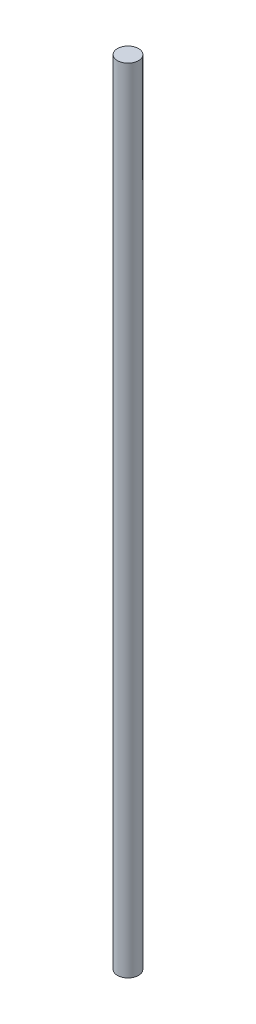
ISO-10303-21;
HEADER;
FILE_DESCRIPTION(('STEP AP214'),'2;1');
FILE_NAME('part.step','',(''),(''),'','','');
FILE_SCHEMA(('AUTOMOTIVE_DESIGN { 1 0 10303 214 1 1 1 1 }'));
ENDSEC;
DATA;
#1=APPLICATION_CONTEXT('core data for automotive mechanical design processes');
#2=APPLICATION_PROTOCOL_DEFINITION('international standard','automotive_design',2000,#1);
#3=PRODUCT_CONTEXT('',#1,'mechanical');
#4=PRODUCT('Part','Part','',(#3));
#5=PRODUCT_RELATED_PRODUCT_CATEGORY('part','',(#4));
#6=PRODUCT_DEFINITION_FORMATION('','',#4);
#7=PRODUCT_DEFINITION_CONTEXT('part definition',#1,'design');
#8=PRODUCT_DEFINITION('design','',#6,#7);
#9=PRODUCT_DEFINITION_SHAPE('','',#8);
#10=(LENGTH_UNIT() NAMED_UNIT(*) SI_UNIT(.MILLI.,.METRE.));
#11=(NAMED_UNIT(*) PLANE_ANGLE_UNIT() SI_UNIT($,.RADIAN.));
#12=(NAMED_UNIT(*) SI_UNIT($,.STERADIAN.) SOLID_ANGLE_UNIT());
#13=UNCERTAINTY_MEASURE_WITH_UNIT(LENGTH_MEASURE(1.E-05),#10,'distance_accuracy_value','');
#14=(GEOMETRIC_REPRESENTATION_CONTEXT(3) GLOBAL_UNCERTAINTY_ASSIGNED_CONTEXT((#13)) GLOBAL_UNIT_ASSIGNED_CONTEXT((#10,
#11,#12)) REPRESENTATION_CONTEXT('',''));
#15=CARTESIAN_POINT('',(0.,0.,0.));
#16=DIRECTION('',(0.,0.,1.));
#17=DIRECTION('',(1.,0.,0.));
#18=AXIS2_PLACEMENT_3D('',#15,#16,#17);
#19=CARTESIAN_POINT('',(0.,151.,0.));
#20=DIRECTION('',(0.,-1.,0.));
#21=DIRECTION('',(0.,0.,-1.));
#22=AXIS2_PLACEMENT_3D('',#19,#20,#21);
#23=CYLINDRICAL_SURFACE('',#22,4.);
#24=CARTESIAN_POINT('',(0.,151.,0.));
#25=DIRECTION('',(0.,1.,0.));
#26=DIRECTION('',(0.,0.,1.));
#27=AXIS2_PLACEMENT_3D('',#24,#25,#26);
#28=CIRCLE('',#27,4.);
#29=CARTESIAN_POINT('',(0.,151.,4.));
#30=VERTEX_POINT('',#29);
#31=EDGE_CURVE('E10',#30,#30,#28,.T.);
#32=ORIENTED_EDGE('',*,*,#31,.F.);
#33=EDGE_LOOP('',(#32));
#34=FACE_BOUND('',#33,.T.);
#35=CARTESIAN_POINT('',(0.,-151.,0.));
#36=DIRECTION('',(0.,1.,0.));
#37=DIRECTION('',(0.,0.,1.));
#38=AXIS2_PLACEMENT_3D('',#35,#36,#37);
#39=CIRCLE('',#38,4.);
#40=CARTESIAN_POINT('',(0.,-151.,4.));
#41=VERTEX_POINT('',#40);
#42=EDGE_CURVE('E33',#41,#41,#39,.T.);
#43=ORIENTED_EDGE('',*,*,#42,.T.);
#44=EDGE_LOOP('',(#43));
#45=FACE_BOUND('',#44,.T.);
#46=ADVANCED_FACE('F30',(#34,#45),#23,.T.);
#47=CARTESIAN_POINT('',(0.,151.,0.));
#48=DIRECTION('',(0.,1.,0.));
#49=DIRECTION('',(0.,0.,1.));
#50=AXIS2_PLACEMENT_3D('',#47,#48,#49);
#51=PLANE('',#50);
#52=ORIENTED_EDGE('',*,*,#31,.T.);
#53=EDGE_LOOP('',(#52));
#54=FACE_BOUND('',#53,.T.);
#55=ADVANCED_FACE('F45',(#54),#51,.T.);
#56=CARTESIAN_POINT('',(0.,-151.,0.));
#57=DIRECTION('',(0.,1.,0.));
#58=DIRECTION('',(0.,0.,1.));
#59=AXIS2_PLACEMENT_3D('',#56,#57,#58);
#60=PLANE('',#59);
#61=ORIENTED_EDGE('',*,*,#42,.F.);
#62=EDGE_LOOP('',(#61));
#63=FACE_BOUND('',#62,.T.);
#64=ADVANCED_FACE('F43',(#63),#60,.F.);
#65=CLOSED_SHELL('',(#46,#55,#64));
#66=MANIFOLD_SOLID_BREP('B2',#65);
#67=ADVANCED_BREP_SHAPE_REPRESENTATION('',(#18,#66),#14);
#68=SHAPE_DEFINITION_REPRESENTATION(#9,#67);
ENDSEC;
END-ISO-10303-21;
